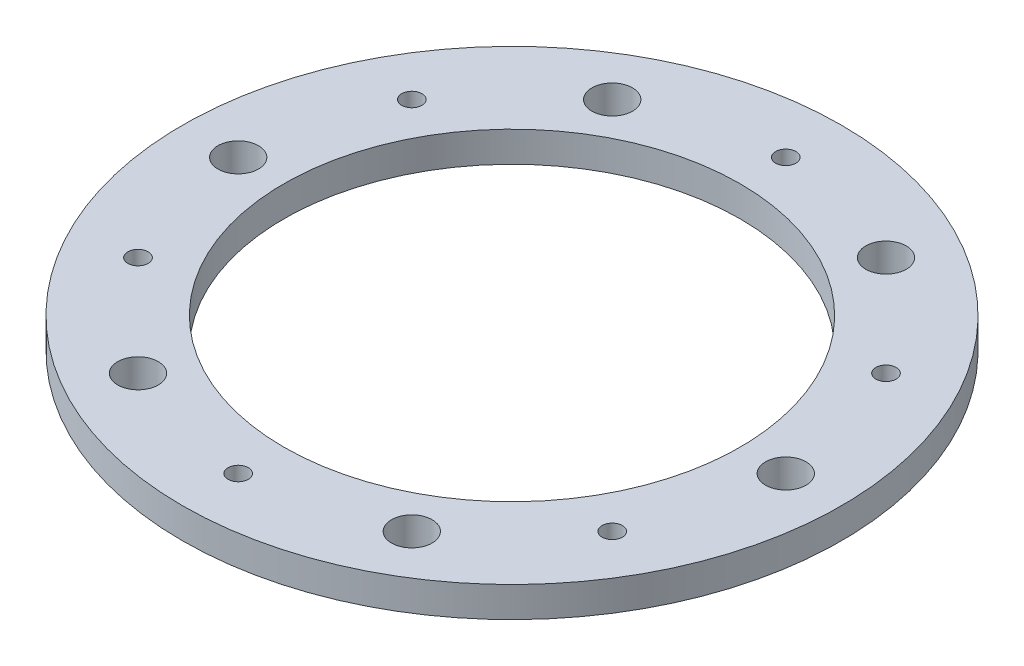
ISO-10303-21;
HEADER;
FILE_DESCRIPTION(('STEP AP214'),'2;1');
FILE_NAME('part.step','',(''),(''),'','','');
FILE_SCHEMA(('AUTOMOTIVE_DESIGN { 1 0 10303 214 1 1 1 1 }'));
ENDSEC;
DATA;
#1=APPLICATION_CONTEXT('core data for automotive mechanical design processes');
#2=APPLICATION_PROTOCOL_DEFINITION('international standard','automotive_design',2000,#1);
#3=PRODUCT_CONTEXT('',#1,'mechanical');
#4=PRODUCT('Part','Part','',(#3));
#5=PRODUCT_RELATED_PRODUCT_CATEGORY('part','',(#4));
#6=PRODUCT_DEFINITION_FORMATION('','',#4);
#7=PRODUCT_DEFINITION_CONTEXT('part definition',#1,'design');
#8=PRODUCT_DEFINITION('design','',#6,#7);
#9=PRODUCT_DEFINITION_SHAPE('','',#8);
#10=(LENGTH_UNIT() NAMED_UNIT(*) SI_UNIT(.MILLI.,.METRE.));
#11=(NAMED_UNIT(*) PLANE_ANGLE_UNIT() SI_UNIT($,.RADIAN.));
#12=(NAMED_UNIT(*) SI_UNIT($,.STERADIAN.) SOLID_ANGLE_UNIT());
#13=UNCERTAINTY_MEASURE_WITH_UNIT(LENGTH_MEASURE(1.E-05),#10,'distance_accuracy_value','');
#14=(GEOMETRIC_REPRESENTATION_CONTEXT(3) GLOBAL_UNCERTAINTY_ASSIGNED_CONTEXT((#13)) GLOBAL_UNIT_ASSIGNED_CONTEXT((#10,
#11,#12)) REPRESENTATION_CONTEXT('',''));
#15=CARTESIAN_POINT('',(0.,0.,0.));
#16=DIRECTION('',(0.,0.,1.));
#17=DIRECTION('',(1.,0.,0.));
#18=AXIS2_PLACEMENT_3D('',#15,#16,#17);
#19=CARTESIAN_POINT('',(0.,3.,0.));
#20=DIRECTION('',(0.,1.,0.));
#21=DIRECTION('',(0.,0.,1.));
#22=AXIS2_PLACEMENT_3D('',#19,#20,#21);
#23=PLANE('',#22);
#24=CARTESIAN_POINT('',(-13.4999999999999,3.,-23.3826859021799));
#25=DIRECTION('',(0.,1.,0.));
#26=DIRECTION('',(0.,0.,1.));
#27=AXIS2_PLACEMENT_3D('',#24,#25,#26);
#28=CIRCLE('',#27,2.);
#29=CARTESIAN_POINT('',(-13.4999999999999,3.,-21.3826859021799));
#30=VERTEX_POINT('',#29);
#31=EDGE_CURVE('E105',#30,#30,#28,.T.);
#32=ORIENTED_EDGE('',*,*,#31,.F.);
#33=EDGE_LOOP('',(#32));
#34=FACE_BOUND('',#33,.T.);
#35=CARTESIAN_POINT('',(13.5000000000001,3.,-23.382685902181));
#36=DIRECTION('',(0.,1.,0.));
#37=DIRECTION('',(0.,0.,1.));
#38=AXIS2_PLACEMENT_3D('',#35,#36,#37);
#39=CIRCLE('',#38,2.);
#40=CARTESIAN_POINT('',(13.5000000000001,3.,-21.382685902181));
#41=VERTEX_POINT('',#40);
#42=EDGE_CURVE('E99',#41,#41,#39,.T.);
#43=ORIENTED_EDGE('',*,*,#42,.F.);
#44=EDGE_LOOP('',(#43));
#45=FACE_BOUND('',#44,.T.);
#46=CARTESIAN_POINT('',(27.000000000001,3.,-1.65012544664584E-12));
#47=DIRECTION('',(0.,1.,0.));
#48=DIRECTION('',(0.,0.,1.));
#49=AXIS2_PLACEMENT_3D('',#46,#47,#48);
#50=CIRCLE('',#49,2.);
#51=CARTESIAN_POINT('',(27.000000000001,3.,1.99999999999835));
#52=VERTEX_POINT('',#51);
#53=EDGE_CURVE('E93',#52,#52,#50,.T.);
#54=ORIENTED_EDGE('',*,*,#53,.F.);
#55=EDGE_LOOP('',(#54));
#56=FACE_BOUND('',#55,.T.);
#57=CARTESIAN_POINT('',(13.5000000000019,3.,23.3826859021787));
#58=DIRECTION('',(0.,1.,0.));
#59=DIRECTION('',(0.,0.,1.));
#60=AXIS2_PLACEMENT_3D('',#57,#58,#59);
#61=CIRCLE('',#60,2.);
#62=CARTESIAN_POINT('',(13.5000000000019,3.,25.3826859021787));
#63=VERTEX_POINT('',#62);
#64=EDGE_CURVE('E86',#63,#63,#61,.T.);
#65=ORIENTED_EDGE('',*,*,#64,.F.);
#66=EDGE_LOOP('',(#65));
#67=FACE_BOUND('',#66,.T.);
#68=CARTESIAN_POINT('',(-13.4999999999981,3.,23.3826859021798));
#69=DIRECTION('',(0.,1.,0.));
#70=DIRECTION('',(0.,0.,1.));
#71=AXIS2_PLACEMENT_3D('',#68,#69,#70);
#72=CIRCLE('',#71,2.);
#73=CARTESIAN_POINT('',(-13.4999999999981,3.,25.3826859021798));
#74=VERTEX_POINT('',#73);
#75=EDGE_CURVE('E116',#74,#74,#72,.T.);
#76=ORIENTED_EDGE('',*,*,#75,.F.);
#77=EDGE_LOOP('',(#76));
#78=FACE_BOUND('',#77,.T.);
#79=CARTESIAN_POINT('',(-26.999999999999,3.,5.4163714549666E-13));
#80=DIRECTION('',(0.,1.,0.));
#81=DIRECTION('',(0.,0.,1.));
#82=AXIS2_PLACEMENT_3D('',#79,#80,#81);
#83=CIRCLE('',#82,2.);
#84=CARTESIAN_POINT('',(-26.999999999999,3.,2.00000000000054));
#85=VERTEX_POINT('',#84);
#86=EDGE_CURVE('E110',#85,#85,#83,.T.);
#87=ORIENTED_EDGE('',*,*,#86,.F.);
#88=EDGE_LOOP('',(#87));
#89=FACE_BOUND('',#88,.T.);
#90=CARTESIAN_POINT('',(0.,3.,0.));
#91=DIRECTION('',(0.,1.,0.));
#92=DIRECTION('',(0.,0.,1.));
#93=AXIS2_PLACEMENT_3D('',#90,#91,#92);
#94=CIRCLE('',#93,22.5);
#95=CARTESIAN_POINT('',(0.,3.,22.5));
#96=VERTEX_POINT('',#95);
#97=EDGE_CURVE('E80',#96,#96,#94,.T.);
#98=ORIENTED_EDGE('',*,*,#97,.F.);
#99=EDGE_LOOP('',(#98));
#100=FACE_BOUND('',#99,.T.);
#101=CARTESIAN_POINT('',(-23.3826859021786,3.,13.5000000000007));
#102=DIRECTION('',(0.,1.,0.));
#103=DIRECTION('',(0.,0.,1.));
#104=AXIS2_PLACEMENT_3D('',#101,#102,#103);
#105=CIRCLE('',#104,1.);
#106=CARTESIAN_POINT('',(-23.3826859021786,3.,14.5000000000007));
#107=VERTEX_POINT('',#106);
#108=EDGE_CURVE('E65',#107,#107,#105,.T.);
#109=ORIENTED_EDGE('',*,*,#108,.F.);
#110=EDGE_LOOP('',(#109));
#111=FACE_BOUND('',#110,.T.);
#112=CARTESIAN_POINT('',(23.3826859021811,3.,13.4999999999993));
#113=DIRECTION('',(0.,1.,0.));
#114=DIRECTION('',(0.,0.,1.));
#115=AXIS2_PLACEMENT_3D('',#112,#113,#114);
#116=CIRCLE('',#115,1.);
#117=CARTESIAN_POINT('',(23.3826859021811,3.,14.4999999999993));
#118=VERTEX_POINT('',#117);
#119=EDGE_CURVE('E53',#118,#118,#116,.T.);
#120=ORIENTED_EDGE('',*,*,#119,.F.);
#121=EDGE_LOOP('',(#120));
#122=FACE_BOUND('',#121,.T.);
#123=CARTESIAN_POINT('',(0.,3.,-27.));
#124=DIRECTION('',(0.,1.,0.));
#125=DIRECTION('',(0.,0.,1.));
#126=AXIS2_PLACEMENT_3D('',#123,#124,#125);
#127=CIRCLE('',#126,1.);
#128=CARTESIAN_POINT('',(0.,3.,-26.));
#129=VERTEX_POINT('',#128);
#130=EDGE_CURVE('E42',#129,#129,#127,.T.);
#131=ORIENTED_EDGE('',*,*,#130,.F.);
#132=EDGE_LOOP('',(#131));
#133=FACE_BOUND('',#132,.T.);
#134=CARTESIAN_POINT('',(0.,3.,0.));
#135=DIRECTION('',(0.,1.,0.));
#136=DIRECTION('',(0.,0.,1.));
#137=AXIS2_PLACEMENT_3D('',#134,#135,#136);
#138=CIRCLE('',#137,32.5);
#139=CARTESIAN_POINT('',(0.,3.,32.5));
#140=VERTEX_POINT('',#139);
#141=EDGE_CURVE('E10',#140,#140,#138,.T.);
#142=ORIENTED_EDGE('',*,*,#141,.T.);
#143=EDGE_LOOP('',(#142));
#144=FACE_BOUND('',#143,.T.);
#145=CARTESIAN_POINT('',(23.3826859021803,3.,-13.5000000000007));
#146=DIRECTION('',(0.,1.,0.));
#147=DIRECTION('',(0.,0.,1.));
#148=AXIS2_PLACEMENT_3D('',#145,#146,#147);
#149=CIRCLE('',#148,1.);
#150=CARTESIAN_POINT('',(23.3826859021803,3.,-12.5000000000007));
#151=VERTEX_POINT('',#150);
#152=EDGE_CURVE('E47',#151,#151,#149,.T.);
#153=ORIENTED_EDGE('',*,*,#152,.F.);
#154=EDGE_LOOP('',(#153));
#155=FACE_BOUND('',#154,.T.);
#156=CARTESIAN_POINT('',(1.69881193778876E-12,3.,27.));
#157=DIRECTION('',(0.,1.,0.));
#158=DIRECTION('',(0.,0.,1.));
#159=AXIS2_PLACEMENT_3D('',#156,#157,#158);
#160=CIRCLE('',#159,1.);
#161=CARTESIAN_POINT('',(1.69881193778876E-12,3.,28.));
#162=VERTEX_POINT('',#161);
#163=EDGE_CURVE('E59',#162,#162,#160,.T.);
#164=ORIENTED_EDGE('',*,*,#163,.F.);
#165=EDGE_LOOP('',(#164));
#166=FACE_BOUND('',#165,.T.);
#167=CARTESIAN_POINT('',(-23.3826859021794,3.,-13.4999999999992));
#168=DIRECTION('',(0.,1.,0.));
#169=DIRECTION('',(0.,0.,1.));
#170=AXIS2_PLACEMENT_3D('',#167,#168,#169);
#171=CIRCLE('',#170,1.);
#172=CARTESIAN_POINT('',(-23.3826859021794,3.,-12.4999999999992));
#173=VERTEX_POINT('',#172);
#174=EDGE_CURVE('E71',#173,#173,#171,.T.);
#175=ORIENTED_EDGE('',*,*,#174,.F.);
#176=EDGE_LOOP('',(#175));
#177=FACE_BOUND('',#176,.T.);
#178=ADVANCED_FACE('F31',(#34,#45,#56,#67,#78,#89,#100,#111,#122,#133,#144,#155,#166,#177),#23,.T.);
#179=CARTESIAN_POINT('',(0.,0.,0.));
#180=DIRECTION('',(0.,1.,0.));
#181=DIRECTION('',(0.,0.,1.));
#182=AXIS2_PLACEMENT_3D('',#179,#180,#181);
#183=PLANE('',#182);
#184=CARTESIAN_POINT('',(-13.4999999999999,0.,-23.3826859021799));
#185=DIRECTION('',(0.,1.,0.));
#186=DIRECTION('',(0.,0.,1.));
#187=AXIS2_PLACEMENT_3D('',#184,#185,#186);
#188=CIRCLE('',#187,2.);
#189=CARTESIAN_POINT('',(-13.4999999999999,0.,-21.3826859021799));
#190=VERTEX_POINT('',#189);
#191=EDGE_CURVE('E83',#190,#190,#188,.T.);
#192=ORIENTED_EDGE('',*,*,#191,.T.);
#193=EDGE_LOOP('',(#192));
#194=FACE_BOUND('',#193,.T.);
#195=CARTESIAN_POINT('',(13.5000000000001,0.,-23.382685902181));
#196=DIRECTION('',(0.,1.,0.));
#197=DIRECTION('',(0.,0.,1.));
#198=AXIS2_PLACEMENT_3D('',#195,#196,#197);
#199=CIRCLE('',#198,2.);
#200=CARTESIAN_POINT('',(13.5000000000001,0.,-21.382685902181));
#201=VERTEX_POINT('',#200);
#202=EDGE_CURVE('E102',#201,#201,#199,.T.);
#203=ORIENTED_EDGE('',*,*,#202,.T.);
#204=EDGE_LOOP('',(#203));
#205=FACE_BOUND('',#204,.T.);
#206=CARTESIAN_POINT('',(27.000000000001,0.,-1.65012544664584E-12));
#207=DIRECTION('',(0.,1.,0.));
#208=DIRECTION('',(0.,0.,1.));
#209=AXIS2_PLACEMENT_3D('',#206,#207,#208);
#210=CIRCLE('',#209,2.);
#211=CARTESIAN_POINT('',(27.000000000001,0.,1.99999999999835));
#212=VERTEX_POINT('',#211);
#213=EDGE_CURVE('E96',#212,#212,#210,.T.);
#214=ORIENTED_EDGE('',*,*,#213,.T.);
#215=EDGE_LOOP('',(#214));
#216=FACE_BOUND('',#215,.T.);
#217=CARTESIAN_POINT('',(13.5000000000019,0.,23.3826859021787));
#218=DIRECTION('',(0.,1.,0.));
#219=DIRECTION('',(0.,0.,1.));
#220=AXIS2_PLACEMENT_3D('',#217,#218,#219);
#221=CIRCLE('',#220,2.);
#222=CARTESIAN_POINT('',(13.5000000000019,0.,25.3826859021787));
#223=VERTEX_POINT('',#222);
#224=EDGE_CURVE('E89',#223,#223,#221,.T.);
#225=ORIENTED_EDGE('',*,*,#224,.T.);
#226=EDGE_LOOP('',(#225));
#227=FACE_BOUND('',#226,.T.);
#228=CARTESIAN_POINT('',(-13.4999999999981,0.,23.3826859021798));
#229=DIRECTION('',(0.,1.,0.));
#230=DIRECTION('',(0.,0.,1.));
#231=AXIS2_PLACEMENT_3D('',#228,#229,#230);
#232=CIRCLE('',#231,2.);
#233=CARTESIAN_POINT('',(-13.4999999999981,0.,25.3826859021798));
#234=VERTEX_POINT('',#233);
#235=EDGE_CURVE('E90',#234,#234,#232,.T.);
#236=ORIENTED_EDGE('',*,*,#235,.T.);
#237=EDGE_LOOP('',(#236));
#238=FACE_BOUND('',#237,.T.);
#239=CARTESIAN_POINT('',(-26.999999999999,0.,5.4163714549666E-13));
#240=DIRECTION('',(0.,1.,0.));
#241=DIRECTION('',(0.,0.,1.));
#242=AXIS2_PLACEMENT_3D('',#239,#240,#241);
#243=CIRCLE('',#242,2.);
#244=CARTESIAN_POINT('',(-26.999999999999,0.,2.00000000000054));
#245=VERTEX_POINT('',#244);
#246=EDGE_CURVE('E113',#245,#245,#243,.T.);
#247=ORIENTED_EDGE('',*,*,#246,.T.);
#248=EDGE_LOOP('',(#247));
#249=FACE_BOUND('',#248,.T.);
#250=CARTESIAN_POINT('',(0.,0.,0.));
#251=DIRECTION('',(0.,1.,0.));
#252=DIRECTION('',(0.,0.,1.));
#253=AXIS2_PLACEMENT_3D('',#250,#251,#252);
#254=CIRCLE('',#253,22.5);
#255=CARTESIAN_POINT('',(0.,0.,22.5));
#256=VERTEX_POINT('',#255);
#257=EDGE_CURVE('E77',#256,#256,#254,.T.);
#258=ORIENTED_EDGE('',*,*,#257,.T.);
#259=EDGE_LOOP('',(#258));
#260=FACE_BOUND('',#259,.T.);
#261=CARTESIAN_POINT('',(0.,0.,0.));
#262=DIRECTION('',(0.,1.,0.));
#263=DIRECTION('',(0.,0.,1.));
#264=AXIS2_PLACEMENT_3D('',#261,#262,#263);
#265=CIRCLE('',#264,32.5);
#266=CARTESIAN_POINT('',(0.,0.,32.5));
#267=VERTEX_POINT('',#266);
#268=EDGE_CURVE('E35',#267,#267,#265,.T.);
#269=ORIENTED_EDGE('',*,*,#268,.F.);
#270=EDGE_LOOP('',(#269));
#271=FACE_BOUND('',#270,.T.);
#272=CARTESIAN_POINT('',(0.,0.,-27.));
#273=DIRECTION('',(0.,1.,0.));
#274=DIRECTION('',(0.,0.,1.));
#275=AXIS2_PLACEMENT_3D('',#272,#273,#274);
#276=CIRCLE('',#275,1.);
#277=CARTESIAN_POINT('',(0.,0.,-26.));
#278=VERTEX_POINT('',#277);
#279=EDGE_CURVE('E44',#278,#278,#276,.T.);
#280=ORIENTED_EDGE('',*,*,#279,.T.);
#281=EDGE_LOOP('',(#280));
#282=FACE_BOUND('',#281,.T.);
#283=CARTESIAN_POINT('',(23.3826859021803,0.,-13.5000000000007));
#284=DIRECTION('',(0.,1.,0.));
#285=DIRECTION('',(0.,0.,1.));
#286=AXIS2_PLACEMENT_3D('',#283,#284,#285);
#287=CIRCLE('',#286,1.);
#288=CARTESIAN_POINT('',(23.3826859021803,0.,-12.5000000000007));
#289=VERTEX_POINT('',#288);
#290=EDGE_CURVE('E50',#289,#289,#287,.T.);
#291=ORIENTED_EDGE('',*,*,#290,.T.);
#292=EDGE_LOOP('',(#291));
#293=FACE_BOUND('',#292,.T.);
#294=CARTESIAN_POINT('',(23.3826859021811,0.,13.4999999999993));
#295=DIRECTION('',(0.,1.,0.));
#296=DIRECTION('',(0.,0.,1.));
#297=AXIS2_PLACEMENT_3D('',#294,#295,#296);
#298=CIRCLE('',#297,1.);
#299=CARTESIAN_POINT('',(23.3826859021811,0.,14.4999999999993));
#300=VERTEX_POINT('',#299);
#301=EDGE_CURVE('E56',#300,#300,#298,.T.);
#302=ORIENTED_EDGE('',*,*,#301,.T.);
#303=EDGE_LOOP('',(#302));
#304=FACE_BOUND('',#303,.T.);
#305=CARTESIAN_POINT('',(1.69881193778876E-12,0.,27.));
#306=DIRECTION('',(0.,1.,0.));
#307=DIRECTION('',(0.,0.,1.));
#308=AXIS2_PLACEMENT_3D('',#305,#306,#307);
#309=CIRCLE('',#308,1.);
#310=CARTESIAN_POINT('',(1.69881193778876E-12,0.,28.));
#311=VERTEX_POINT('',#310);
#312=EDGE_CURVE('E62',#311,#311,#309,.T.);
#313=ORIENTED_EDGE('',*,*,#312,.T.);
#314=EDGE_LOOP('',(#313));
#315=FACE_BOUND('',#314,.T.);
#316=CARTESIAN_POINT('',(-23.3826859021786,0.,13.5000000000007));
#317=DIRECTION('',(0.,1.,0.));
#318=DIRECTION('',(0.,0.,1.));
#319=AXIS2_PLACEMENT_3D('',#316,#317,#318);
#320=CIRCLE('',#319,1.);
#321=CARTESIAN_POINT('',(-23.3826859021786,0.,14.5000000000007));
#322=VERTEX_POINT('',#321);
#323=EDGE_CURVE('E68',#322,#322,#320,.T.);
#324=ORIENTED_EDGE('',*,*,#323,.T.);
#325=EDGE_LOOP('',(#324));
#326=FACE_BOUND('',#325,.T.);
#327=CARTESIAN_POINT('',(-23.3826859021794,0.,-13.4999999999992));
#328=DIRECTION('',(0.,1.,0.));
#329=DIRECTION('',(0.,0.,1.));
#330=AXIS2_PLACEMENT_3D('',#327,#328,#329);
#331=CIRCLE('',#330,1.);
#332=CARTESIAN_POINT('',(-23.3826859021794,0.,-12.4999999999992));
#333=VERTEX_POINT('',#332);
#334=EDGE_CURVE('E74',#333,#333,#331,.T.);
#335=ORIENTED_EDGE('',*,*,#334,.T.);
#336=EDGE_LOOP('',(#335));
#337=FACE_BOUND('',#336,.T.);
#338=ADVANCED_FACE('F122',(#194,#205,#216,#227,#238,#249,#260,#271,#282,#293,#304,#315,#326,
#337),#183,.F.);
#339=CARTESIAN_POINT('',(0.,3.,0.));
#340=DIRECTION('',(0.,-1.,0.));
#341=DIRECTION('',(0.,0.,-1.));
#342=AXIS2_PLACEMENT_3D('',#339,#340,#341);
#343=CYLINDRICAL_SURFACE('',#342,32.5);
#344=ORIENTED_EDGE('',*,*,#141,.F.);
#345=EDGE_LOOP('',(#344));
#346=FACE_BOUND('',#345,.T.);
#347=ORIENTED_EDGE('',*,*,#268,.T.);
#348=EDGE_LOOP('',(#347));
#349=FACE_BOUND('',#348,.T.);
#350=ADVANCED_FACE('F33',(#346,#349),#343,.T.);
#351=CARTESIAN_POINT('',(0.,3.,-27.));
#352=DIRECTION('',(0.,-1.,0.));
#353=DIRECTION('',(0.,0.,-1.));
#354=AXIS2_PLACEMENT_3D('',#351,#352,#353);
#355=CYLINDRICAL_SURFACE('',#354,1.);
#356=ORIENTED_EDGE('',*,*,#130,.T.);
#357=EDGE_LOOP('',(#356));
#358=FACE_BOUND('',#357,.T.);
#359=ORIENTED_EDGE('',*,*,#279,.F.);
#360=EDGE_LOOP('',(#359));
#361=FACE_BOUND('',#360,.T.);
#362=ADVANCED_FACE('F166',(#358,#361),#355,.F.);
#363=CARTESIAN_POINT('',(23.3826859021803,3.,-13.5000000000007));
#364=DIRECTION('',(0.,-1.,0.));
#365=DIRECTION('',(0.,0.,-1.));
#366=AXIS2_PLACEMENT_3D('',#363,#364,#365);
#367=CYLINDRICAL_SURFACE('',#366,1.);
#368=ORIENTED_EDGE('',*,*,#152,.T.);
#369=EDGE_LOOP('',(#368));
#370=FACE_BOUND('',#369,.T.);
#371=ORIENTED_EDGE('',*,*,#290,.F.);
#372=EDGE_LOOP('',(#371));
#373=FACE_BOUND('',#372,.T.);
#374=ADVANCED_FACE('F172',(#370,#373),#367,.F.);
#375=CARTESIAN_POINT('',(23.3826859021811,3.,13.4999999999993));
#376=DIRECTION('',(0.,-1.,0.));
#377=DIRECTION('',(0.,0.,-1.));
#378=AXIS2_PLACEMENT_3D('',#375,#376,#377);
#379=CYLINDRICAL_SURFACE('',#378,1.);
#380=ORIENTED_EDGE('',*,*,#119,.T.);
#381=EDGE_LOOP('',(#380));
#382=FACE_BOUND('',#381,.T.);
#383=ORIENTED_EDGE('',*,*,#301,.F.);
#384=EDGE_LOOP('',(#383));
#385=FACE_BOUND('',#384,.T.);
#386=ADVANCED_FACE('F176',(#382,#385),#379,.F.);
#387=CARTESIAN_POINT('',(1.69881193778876E-12,3.,27.));
#388=DIRECTION('',(0.,-1.,0.));
#389=DIRECTION('',(0.,0.,-1.));
#390=AXIS2_PLACEMENT_3D('',#387,#388,#389);
#391=CYLINDRICAL_SURFACE('',#390,1.);
#392=ORIENTED_EDGE('',*,*,#163,.T.);
#393=EDGE_LOOP('',(#392));
#394=FACE_BOUND('',#393,.T.);
#395=ORIENTED_EDGE('',*,*,#312,.F.);
#396=EDGE_LOOP('',(#395));
#397=FACE_BOUND('',#396,.T.);
#398=ADVANCED_FACE('F180',(#394,#397),#391,.F.);
#399=CARTESIAN_POINT('',(-23.3826859021786,3.,13.5000000000007));
#400=DIRECTION('',(0.,-1.,0.));
#401=DIRECTION('',(0.,0.,-1.));
#402=AXIS2_PLACEMENT_3D('',#399,#400,#401);
#403=CYLINDRICAL_SURFACE('',#402,1.);
#404=ORIENTED_EDGE('',*,*,#108,.T.);
#405=EDGE_LOOP('',(#404));
#406=FACE_BOUND('',#405,.T.);
#407=ORIENTED_EDGE('',*,*,#323,.F.);
#408=EDGE_LOOP('',(#407));
#409=FACE_BOUND('',#408,.T.);
#410=ADVANCED_FACE('F157',(#406,#409),#403,.F.);
#411=CARTESIAN_POINT('',(-23.3826859021794,3.,-13.4999999999992));
#412=DIRECTION('',(0.,-1.,0.));
#413=DIRECTION('',(0.,0.,-1.));
#414=AXIS2_PLACEMENT_3D('',#411,#412,#413);
#415=CYLINDRICAL_SURFACE('',#414,1.);
#416=ORIENTED_EDGE('',*,*,#174,.T.);
#417=EDGE_LOOP('',(#416));
#418=FACE_BOUND('',#417,.T.);
#419=ORIENTED_EDGE('',*,*,#334,.F.);
#420=EDGE_LOOP('',(#419));
#421=FACE_BOUND('',#420,.T.);
#422=ADVANCED_FACE('F153',(#418,#421),#415,.F.);
#423=CARTESIAN_POINT('',(0.,0.,0.));
#424=DIRECTION('',(0.,1.,0.));
#425=DIRECTION('',(0.,0.,1.));
#426=AXIS2_PLACEMENT_3D('',#423,#424,#425);
#427=CYLINDRICAL_SURFACE('',#426,22.5);
#428=ORIENTED_EDGE('',*,*,#257,.F.);
#429=EDGE_LOOP('',(#428));
#430=FACE_BOUND('',#429,.T.);
#431=ORIENTED_EDGE('',*,*,#97,.T.);
#432=EDGE_LOOP('',(#431));
#433=FACE_BOUND('',#432,.T.);
#434=ADVANCED_FACE('F156',(#430,#433),#427,.F.);
#435=CARTESIAN_POINT('',(-26.999999999999,0.,5.4163714549666E-13));
#436=DIRECTION('',(0.,1.,0.));
#437=DIRECTION('',(0.,0.,1.));
#438=AXIS2_PLACEMENT_3D('',#435,#436,#437);
#439=CYLINDRICAL_SURFACE('',#438,2.);
#440=ORIENTED_EDGE('',*,*,#246,.F.);
#441=EDGE_LOOP('',(#440));
#442=FACE_BOUND('',#441,.T.);
#443=ORIENTED_EDGE('',*,*,#86,.T.);
#444=EDGE_LOOP('',(#443));
#445=FACE_BOUND('',#444,.T.);
#446=ADVANCED_FACE('F129',(#442,#445),#439,.F.);
#447=CARTESIAN_POINT('',(-13.4999999999981,0.,23.3826859021798));
#448=DIRECTION('',(0.,1.,0.));
#449=DIRECTION('',(0.,0.,1.));
#450=AXIS2_PLACEMENT_3D('',#447,#448,#449);
#451=CYLINDRICAL_SURFACE('',#450,2.);
#452=ORIENTED_EDGE('',*,*,#235,.F.);
#453=EDGE_LOOP('',(#452));
#454=FACE_BOUND('',#453,.T.);
#455=ORIENTED_EDGE('',*,*,#75,.T.);
#456=EDGE_LOOP('',(#455));
#457=FACE_BOUND('',#456,.T.);
#458=ADVANCED_FACE('F125',(#454,#457),#451,.F.);
#459=CARTESIAN_POINT('',(13.5000000000019,0.,23.3826859021787));
#460=DIRECTION('',(0.,1.,0.));
#461=DIRECTION('',(0.,0.,1.));
#462=AXIS2_PLACEMENT_3D('',#459,#460,#461);
#463=CYLINDRICAL_SURFACE('',#462,2.);
#464=ORIENTED_EDGE('',*,*,#224,.F.);
#465=EDGE_LOOP('',(#464));
#466=FACE_BOUND('',#465,.T.);
#467=ORIENTED_EDGE('',*,*,#64,.T.);
#468=EDGE_LOOP('',(#467));
#469=FACE_BOUND('',#468,.T.);
#470=ADVANCED_FACE('F128',(#466,#469),#463,.F.);
#471=CARTESIAN_POINT('',(27.000000000001,0.,-1.65012544664584E-12));
#472=DIRECTION('',(0.,1.,0.));
#473=DIRECTION('',(0.,0.,1.));
#474=AXIS2_PLACEMENT_3D('',#471,#472,#473);
#475=CYLINDRICAL_SURFACE('',#474,2.);
#476=ORIENTED_EDGE('',*,*,#213,.F.);
#477=EDGE_LOOP('',(#476));
#478=FACE_BOUND('',#477,.T.);
#479=ORIENTED_EDGE('',*,*,#53,.T.);
#480=EDGE_LOOP('',(#479));
#481=FACE_BOUND('',#480,.T.);
#482=ADVANCED_FACE('F193',(#478,#481),#475,.F.);
#483=CARTESIAN_POINT('',(13.5000000000001,0.,-23.382685902181));
#484=DIRECTION('',(0.,1.,0.));
#485=DIRECTION('',(0.,0.,1.));
#486=AXIS2_PLACEMENT_3D('',#483,#484,#485);
#487=CYLINDRICAL_SURFACE('',#486,2.);
#488=ORIENTED_EDGE('',*,*,#202,.F.);
#489=EDGE_LOOP('',(#488));
#490=FACE_BOUND('',#489,.T.);
#491=ORIENTED_EDGE('',*,*,#42,.T.);
#492=EDGE_LOOP('',(#491));
#493=FACE_BOUND('',#492,.T.);
#494=ADVANCED_FACE('F197',(#490,#493),#487,.F.);
#495=CARTESIAN_POINT('',(-13.4999999999999,0.,-23.3826859021799));
#496=DIRECTION('',(0.,1.,0.));
#497=DIRECTION('',(0.,0.,1.));
#498=AXIS2_PLACEMENT_3D('',#495,#496,#497);
#499=CYLINDRICAL_SURFACE('',#498,2.);
#500=ORIENTED_EDGE('',*,*,#191,.F.);
#501=EDGE_LOOP('',(#500));
#502=FACE_BOUND('',#501,.T.);
#503=ORIENTED_EDGE('',*,*,#31,.T.);
#504=EDGE_LOOP('',(#503));
#505=FACE_BOUND('',#504,.T.);
#506=ADVANCED_FACE('F201',(#502,#505),#499,.F.);
#507=CLOSED_SHELL('',(#178,#338,#350,#362,#374,#386,#398,#410,#422,#434,#446,#458,#470,#482,
#494,#506));
#508=MANIFOLD_SOLID_BREP('B2',#507);
#509=ADVANCED_BREP_SHAPE_REPRESENTATION('',(#18,#508),#14);
#510=SHAPE_DEFINITION_REPRESENTATION(#9,#509);
ENDSEC;
END-ISO-10303-21;
